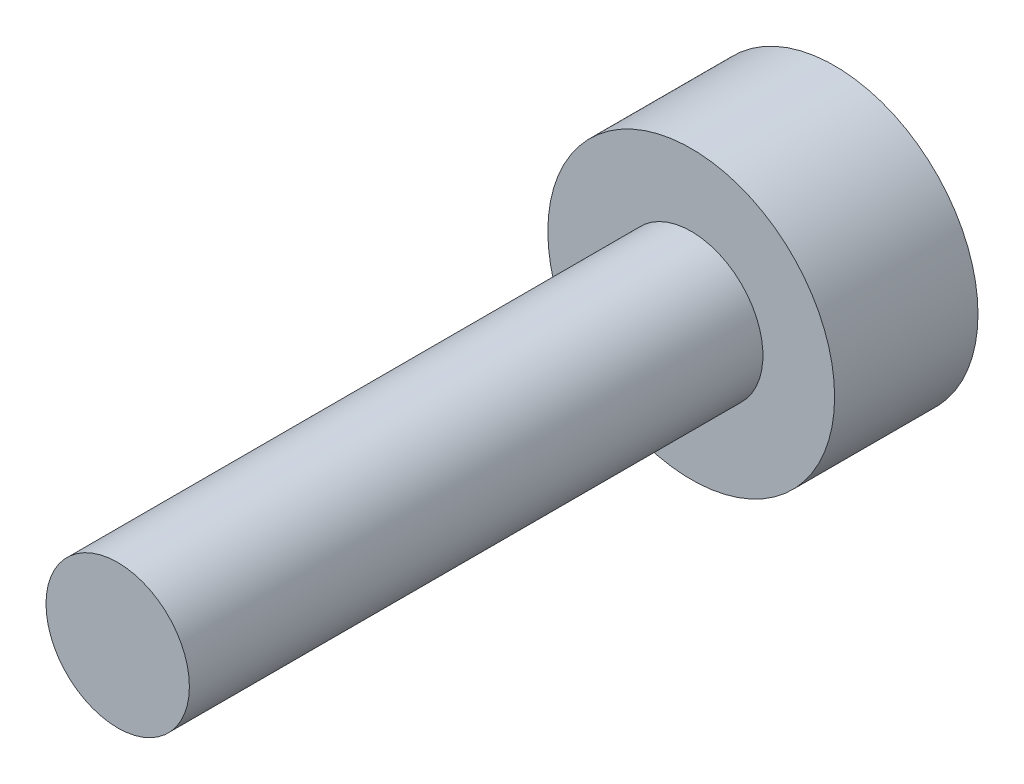
ISO-10303-21;
HEADER;
FILE_DESCRIPTION(('STEP AP214'),'2;1');
FILE_NAME('part.step','',(''),(''),'','','');
FILE_SCHEMA(('AUTOMOTIVE_DESIGN { 1 0 10303 214 1 1 1 1 }'));
ENDSEC;
DATA;
#1=APPLICATION_CONTEXT('core data for automotive mechanical design processes');
#2=APPLICATION_PROTOCOL_DEFINITION('international standard','automotive_design',2000,#1);
#3=PRODUCT_CONTEXT('',#1,'mechanical');
#4=PRODUCT('Part','Part','',(#3));
#5=PRODUCT_RELATED_PRODUCT_CATEGORY('part','',(#4));
#6=PRODUCT_DEFINITION_FORMATION('','',#4);
#7=PRODUCT_DEFINITION_CONTEXT('part definition',#1,'design');
#8=PRODUCT_DEFINITION('design','',#6,#7);
#9=PRODUCT_DEFINITION_SHAPE('','',#8);
#10=(LENGTH_UNIT() NAMED_UNIT(*) SI_UNIT(.MILLI.,.METRE.));
#11=(NAMED_UNIT(*) PLANE_ANGLE_UNIT() SI_UNIT($,.RADIAN.));
#12=(NAMED_UNIT(*) SI_UNIT($,.STERADIAN.) SOLID_ANGLE_UNIT());
#13=UNCERTAINTY_MEASURE_WITH_UNIT(LENGTH_MEASURE(1.E-05),#10,'distance_accuracy_value','');
#14=(GEOMETRIC_REPRESENTATION_CONTEXT(3) GLOBAL_UNCERTAINTY_ASSIGNED_CONTEXT((#13)) GLOBAL_UNIT_ASSIGNED_CONTEXT((#10,
#11,#12)) REPRESENTATION_CONTEXT('',''));
#15=CARTESIAN_POINT('',(0.,0.,0.));
#16=DIRECTION('',(0.,0.,1.));
#17=DIRECTION('',(1.,0.,0.));
#18=AXIS2_PLACEMENT_3D('',#15,#16,#17);
#19=CARTESIAN_POINT('',(0.,0.,12.));
#20=DIRECTION('',(0.,0.,-1.));
#21=DIRECTION('',(-1.,0.,0.));
#22=AXIS2_PLACEMENT_3D('',#19,#20,#21);
#23=CYLINDRICAL_SURFACE('',#22,1.5);
#24=CARTESIAN_POINT('',(0.,0.,12.));
#25=DIRECTION('',(0.,0.,1.));
#26=DIRECTION('',(1.,0.,0.));
#27=AXIS2_PLACEMENT_3D('',#24,#25,#26);
#28=CIRCLE('',#27,1.5);
#29=CARTESIAN_POINT('',(1.5,0.,12.));
#30=VERTEX_POINT('',#29);
#31=EDGE_CURVE('E10',#30,#30,#28,.T.);
#32=ORIENTED_EDGE('',*,*,#31,.F.);
#33=EDGE_LOOP('',(#32));
#34=FACE_BOUND('',#33,.T.);
#35=CARTESIAN_POINT('',(0.,0.,0.));
#36=DIRECTION('',(0.,0.,-1.));
#37=DIRECTION('',(-1.,0.,0.));
#38=AXIS2_PLACEMENT_3D('',#35,#36,#37);
#39=CIRCLE('',#38,1.5);
#40=CARTESIAN_POINT('',(-1.5,0.,0.));
#41=VERTEX_POINT('',#40);
#42=EDGE_CURVE('E38',#41,#41,#39,.T.);
#43=ORIENTED_EDGE('',*,*,#42,.F.);
#44=EDGE_LOOP('',(#43));
#45=FACE_BOUND('',#44,.T.);
#46=ADVANCED_FACE('F32',(#34,#45),#23,.T.);
#47=CARTESIAN_POINT('',(0.,0.,12.));
#48=DIRECTION('',(0.,0.,1.));
#49=DIRECTION('',(1.,0.,0.));
#50=AXIS2_PLACEMENT_3D('',#47,#48,#49);
#51=PLANE('',#50);
#52=ORIENTED_EDGE('',*,*,#31,.T.);
#53=EDGE_LOOP('',(#52));
#54=FACE_BOUND('',#53,.T.);
#55=ADVANCED_FACE('F65',(#54),#51,.T.);
#56=CARTESIAN_POINT('',(0.,0.,-3.));
#57=DIRECTION('',(0.,0.,1.));
#58=DIRECTION('',(1.,0.,0.));
#59=AXIS2_PLACEMENT_3D('',#56,#57,#58);
#60=CYLINDRICAL_SURFACE('',#59,3.);
#61=CARTESIAN_POINT('',(0.,0.,-3.));
#62=DIRECTION('',(0.,0.,-1.));
#63=DIRECTION('',(-1.,0.,0.));
#64=AXIS2_PLACEMENT_3D('',#61,#62,#63);
#65=CIRCLE('',#64,3.);
#66=CARTESIAN_POINT('',(-3.,0.,-3.));
#67=VERTEX_POINT('',#66);
#68=EDGE_CURVE('E42',#67,#67,#65,.T.);
#69=ORIENTED_EDGE('',*,*,#68,.F.);
#70=EDGE_LOOP('',(#69));
#71=FACE_BOUND('',#70,.T.);
#72=CARTESIAN_POINT('',(0.,0.,0.));
#73=DIRECTION('',(0.,0.,-1.));
#74=DIRECTION('',(-1.,0.,0.));
#75=AXIS2_PLACEMENT_3D('',#72,#73,#74);
#76=CIRCLE('',#75,3.);
#77=CARTESIAN_POINT('',(-3.,0.,0.));
#78=VERTEX_POINT('',#77);
#79=EDGE_CURVE('E46',#78,#78,#76,.T.);
#80=ORIENTED_EDGE('',*,*,#79,.T.);
#81=EDGE_LOOP('',(#80));
#82=FACE_BOUND('',#81,.T.);
#83=ADVANCED_FACE('F52',(#71,#82),#60,.T.);
#84=CARTESIAN_POINT('',(0.,0.,-3.));
#85=DIRECTION('',(0.,0.,-1.));
#86=DIRECTION('',(-1.,0.,0.));
#87=AXIS2_PLACEMENT_3D('',#84,#85,#86);
#88=PLANE('',#87);
#89=ORIENTED_EDGE('',*,*,#68,.T.);
#90=EDGE_LOOP('',(#89));
#91=FACE_BOUND('',#90,.T.);
#92=ADVANCED_FACE('F56',(#91),#88,.T.);
#93=CARTESIAN_POINT('',(0.,0.,0.));
#94=DIRECTION('',(0.,0.,-1.));
#95=DIRECTION('',(-1.,0.,0.));
#96=AXIS2_PLACEMENT_3D('',#93,#94,#95);
#97=PLANE('',#96);
#98=ORIENTED_EDGE('',*,*,#42,.T.);
#99=EDGE_LOOP('',(#98));
#100=FACE_BOUND('',#99,.T.);
#101=ORIENTED_EDGE('',*,*,#79,.F.);
#102=EDGE_LOOP('',(#101));
#103=FACE_BOUND('',#102,.T.);
#104=ADVANCED_FACE('F54',(#100,#103),#97,.F.);
#105=CLOSED_SHELL('',(#46,#55,#83,#92,#104));
#106=MANIFOLD_SOLID_BREP('B2',#105);
#107=ADVANCED_BREP_SHAPE_REPRESENTATION('',(#18,#106),#14);
#108=SHAPE_DEFINITION_REPRESENTATION(#9,#107);
ENDSEC;
END-ISO-10303-21;
